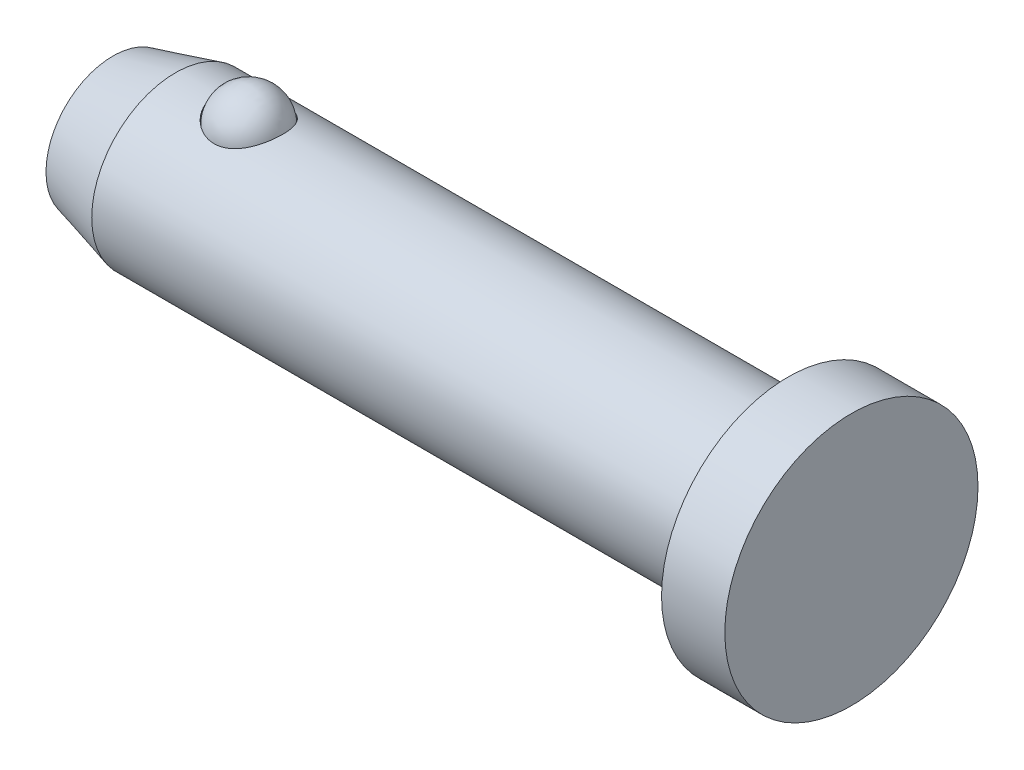
ISO-10303-21;
HEADER;
FILE_DESCRIPTION(('STEP AP214'),'2;1');
FILE_NAME('part.step','',(''),(''),'','','');
FILE_SCHEMA(('AUTOMOTIVE_DESIGN { 1 0 10303 214 1 1 1 1 }'));
ENDSEC;
DATA;
#1=APPLICATION_CONTEXT('core data for automotive mechanical design processes');
#2=APPLICATION_PROTOCOL_DEFINITION('international standard','automotive_design',2000,#1);
#3=PRODUCT_CONTEXT('',#1,'mechanical');
#4=PRODUCT('Part','Part','',(#3));
#5=PRODUCT_RELATED_PRODUCT_CATEGORY('part','',(#4));
#6=PRODUCT_DEFINITION_FORMATION('','',#4);
#7=PRODUCT_DEFINITION_CONTEXT('part definition',#1,'design');
#8=PRODUCT_DEFINITION('design','',#6,#7);
#9=PRODUCT_DEFINITION_SHAPE('','',#8);
#10=(LENGTH_UNIT() NAMED_UNIT(*) SI_UNIT(.MILLI.,.METRE.));
#11=(NAMED_UNIT(*) PLANE_ANGLE_UNIT() SI_UNIT($,.RADIAN.));
#12=(NAMED_UNIT(*) SI_UNIT($,.STERADIAN.) SOLID_ANGLE_UNIT());
#13=UNCERTAINTY_MEASURE_WITH_UNIT(LENGTH_MEASURE(1.E-05),#10,'distance_accuracy_value','');
#14=(GEOMETRIC_REPRESENTATION_CONTEXT(3) GLOBAL_UNCERTAINTY_ASSIGNED_CONTEXT((#13)) GLOBAL_UNIT_ASSIGNED_CONTEXT((#10,
#11,#12)) REPRESENTATION_CONTEXT('',''));
#15=CARTESIAN_POINT('',(0.,0.,0.));
#16=DIRECTION('',(0.,0.,1.));
#17=DIRECTION('',(1.,0.,0.));
#18=AXIS2_PLACEMENT_3D('',#15,#16,#17);
#19=CARTESIAN_POINT('',(-20.2908101482499,2.83464,0.));
#20=DIRECTION('',(-1.,0.,0.));
#21=DIRECTION('',(0.,1.,0.));
#22=AXIS2_PLACEMENT_3D('',#19,#20,#21);
#23=SPHERICAL_SURFACE('',#22,1.28015999999999);
#24=CARTESIAN_POINT('',(-21.5709701482499,2.83464,0.));
#25=VERTEX_POINT('',#24);
#26=VERTEX_LOOP('',#25);
#27=FACE_BOUND('',#26,.T.);
#28=ADVANCED_FACE('F36',(#27),#23,.T.);
#29=CLOSED_SHELL('',(#28));
#30=MANIFOLD_SOLID_BREP('B2',#29);
#31=CARTESIAN_POINT('',(2.38125,0.,0.));
#32=DIRECTION('',(-1.,0.,0.));
#33=DIRECTION('',(0.,0.,1.));
#34=AXIS2_PLACEMENT_3D('',#31,#32,#33);
#35=CYLINDRICAL_SURFACE('',#34,3.1496);
#36=CARTESIAN_POINT('',(0.,0.,0.));
#37=DIRECTION('',(-1.,0.,0.));
#38=DIRECTION('',(0.,0.,1.));
#39=AXIS2_PLACEMENT_3D('',#36,#37,#38);
#40=CIRCLE('',#39,3.1496);
#41=CARTESIAN_POINT('',(0.,0.,3.1496));
#42=VERTEX_POINT('',#41);
#43=EDGE_CURVE('E72',#42,#42,#40,.T.);
#44=ORIENTED_EDGE('',*,*,#43,.T.);
#45=EDGE_LOOP('',(#44));
#46=FACE_BOUND('',#45,.T.);
#47=CARTESIAN_POINT('',(-23.0491065552962,0.,0.));
#48=DIRECTION('',(-1.,0.,0.));
#49=DIRECTION('',(0.,0.,1.));
#50=AXIS2_PLACEMENT_3D('',#47,#48,#49);
#51=CIRCLE('',#50,3.1496);
#52=CARTESIAN_POINT('',(-23.0491065552962,0.,3.1496));
#53=VERTEX_POINT('',#52);
#54=EDGE_CURVE('E69',#53,#53,#51,.T.);
#55=ORIENTED_EDGE('',*,*,#54,.F.);
#56=EDGE_LOOP('',(#55));
#57=FACE_BOUND('',#56,.T.);
#58=CARTESIAN_POINT('',(-20.2908101482499,2.86644462365592,-1.30517254779463));
#59=CARTESIAN_POINT('',(-20.3584615700745,2.86645120810558,-1.30516627721907));
#60=CARTESIAN_POINT('',(-20.4262038763816,2.86889640922081,-1.2998296921368));
#61=CARTESIAN_POINT('',(-20.5597927545076,2.87841443133969,-1.27860756712863));
#62=CARTESIAN_POINT('',(-20.6256342907558,2.88549854300094,-1.26269628801136));
#63=CARTESIAN_POINT('',(-20.7532966399318,2.90345639685791,-1.22083373320291));
#64=CARTESIAN_POINT('',(-20.8151275870991,2.91432010753833,-1.19490901452217));
#65=CARTESIAN_POINT('',(-20.9333758926375,2.93865637911198,-1.13373584689953));
#66=CARTESIAN_POINT('',(-20.9897952223712,2.95212798455326,-1.09849081090784));
#67=CARTESIAN_POINT('',(-21.0976571877632,2.98074498577069,-1.0183323553499));
#68=CARTESIAN_POINT('',(-21.1488926959029,2.99592918687942,-0.973154297406758));
#69=CARTESIAN_POINT('',(-21.243273368842,3.02606872849191,-0.874942493647648));
#70=CARTESIAN_POINT('',(-21.2864161842841,3.04102400138281,-0.82190647459172));
#71=CARTESIAN_POINT('',(-21.3654635682132,3.06986483374138,-0.706806772891374));
#72=CARTESIAN_POINT('',(-21.4009696454553,3.0836751320368,-0.644449947334676));
#73=CARTESIAN_POINT('',(-21.4615279393875,3.10803791630581,-0.514260615012527));
#74=CARTESIAN_POINT('',(-21.4865797211067,3.11859026672152,-0.44642788055155));
#75=CARTESIAN_POINT('',(-21.5258432649537,3.13542350354035,-0.306720545547743));
#76=CARTESIAN_POINT('',(-21.5399867354117,3.14167745363759,-0.234823458328797));
#77=CARTESIAN_POINT('',(-21.5568768166277,3.14917053223427,-0.0894484319703957));
#78=CARTESIAN_POINT('',(-21.5596241666089,3.15040998600495,-0.0159705956789428));
#79=CARTESIAN_POINT('',(-21.5537013218313,3.14776543124335,0.129582760764466));
#80=CARTESIAN_POINT('',(-21.5451615760937,3.14393995900208,0.201664702371148));
#81=CARTESIAN_POINT('',(-21.5170675749165,3.13164785753818,0.343237304349766));
#82=CARTESIAN_POINT('',(-21.4975131818881,3.12318117034008,0.412727932340873));
#83=CARTESIAN_POINT('',(-21.4477405136155,3.1024305084263,0.547313676378039));
#84=CARTESIAN_POINT('',(-21.4175029903445,3.09013964841806,0.612400604299479));
#85=CARTESIAN_POINT('',(-21.3469744802468,3.06298509965563,0.736293755544046));
#86=CARTESIAN_POINT('',(-21.3066823856803,3.04812112746988,0.795099285808196));
#87=CARTESIAN_POINT('',(-21.2163549129872,3.01718244943965,0.905492865822567));
#88=CARTESIAN_POINT('',(-21.1662146218955,3.00109596437033,0.956991889068021));
#89=CARTESIAN_POINT('',(-21.0575932444339,2.9696347739982,1.05056759756218));
#90=CARTESIAN_POINT('',(-20.9991123664282,2.95426005092689,1.09264451812599));
#91=CARTESIAN_POINT('',(-20.8761067993376,2.92621382140221,1.16566188085754));
#92=CARTESIAN_POINT('',(-20.8116768479043,2.91350788022834,1.19674824847867));
#93=CARTESIAN_POINT('',(-20.677884917612,2.89208528207644,1.24763483683174));
#94=CARTESIAN_POINT('',(-20.6085248455949,2.88336709233661,1.26743939464355));
#95=CARTESIAN_POINT('',(-20.4705876605634,2.87134908188668,1.2944276664485));
#96=CARTESIAN_POINT('',(-20.402146622846,2.86779879634614,1.30219605165818));
#97=CARTESIAN_POINT('',(-20.2648319229011,2.86573303951103,1.30673731781528));
#98=CARTESIAN_POINT('',(-20.1959583626619,2.86721642271972,1.30351270040626));
#99=CARTESIAN_POINT('',(-20.0623493485509,2.87489141215312,1.28649091309454));
#100=CARTESIAN_POINT('',(-19.9975542222447,2.88091137048104,1.2730790489579));
#101=CARTESIAN_POINT('',(-19.8712707451091,2.89678755110716,1.23652566514967));
#102=CARTESIAN_POINT('',(-19.809782657288,2.9066440780153,1.2133833729049));
#103=CARTESIAN_POINT('',(-19.6904050490409,2.92938831614765,1.15740694245089));
#104=CARTESIAN_POINT('',(-19.6326163379987,2.94233453751268,1.12438213906298));
#105=CARTESIAN_POINT('',(-19.5233614374649,2.9698064487385,1.04967158608701));
#106=CARTESIAN_POINT('',(-19.4718967675169,2.98433251663115,1.00798376139446));
#107=CARTESIAN_POINT('',(-19.3738398555789,3.01431230742029,0.91456312218175));
#108=CARTESIAN_POINT('',(-19.3276403416089,3.02977497840605,0.862420579691551));
#109=CARTESIAN_POINT('',(-19.2443295333746,3.0593054267626,0.750967302894715));
#110=CARTESIAN_POINT('',(-19.2072198559509,3.07337295571019,0.691655296128649));
#111=CARTESIAN_POINT('',(-19.1418306904921,3.0991106045334,0.56547267360454));
#112=CARTESIAN_POINT('',(-19.1138546005728,3.11069464738316,0.498426853070583));
#113=CARTESIAN_POINT('',(-19.0689028037238,3.12971435338124,0.360186065118016));
#114=CARTESIAN_POINT('',(-19.0519268467929,3.13715011080756,0.288991192035472));
#115=CARTESIAN_POINT('',(-19.0293794429385,3.14709399458619,0.144825349487548));
#116=CARTESIAN_POINT('',(-19.0237546797191,3.1496251554703,0.071864319967431));
#117=CARTESIAN_POINT('',(-19.0238679510141,3.1495744672443,-0.0740445118091371));
#118=CARTESIAN_POINT('',(-19.0296054477903,3.14699286010458,-0.146992314528164));
#119=CARTESIAN_POINT('',(-19.0522211569186,3.1370217911424,-0.290135657969068));
#120=CARTESIAN_POINT('',(-19.0690009610771,3.12967480623413,-0.360349759795402));
#121=CARTESIAN_POINT('',(-19.1132647946634,3.11094224808444,-0.496749663785287));
#122=CARTESIAN_POINT('',(-19.1407495278568,3.09955640932429,-0.562935200771284));
#123=CARTESIAN_POINT('',(-19.2061398868693,3.07377872302876,-0.690003068394926));
#124=CARTESIAN_POINT('',(-19.2441281965399,3.05936325181532,-0.75083805084068));
#125=CARTESIAN_POINT('',(-19.3296530842171,3.02907533463561,-0.86497017477159));
#126=CARTESIAN_POINT('',(-19.3771897662726,3.01320287279351,-0.918267234105018));
#127=CARTESIAN_POINT('',(-19.4811162211087,2.9816078325526,-1.01620049828937));
#128=CARTESIAN_POINT('',(-19.5375585014219,2.96588677039235,-1.06078158191953));
#129=CARTESIAN_POINT('',(-19.6577729728809,2.93649460872109,-1.13963081158192));
#130=CARTESIAN_POINT('',(-19.7215478219846,2.92282425672961,-1.17389520156128));
#131=CARTESIAN_POINT('',(-19.8527336829711,2.89955852837399,-1.23022207572249));
#132=CARTESIAN_POINT('',(-19.9199875429827,2.88985734167204,-1.25260690052147));
#133=CARTESIAN_POINT('',(-20.0576462094761,2.87520526487589,-1.28589141852941));
#134=CARTESIAN_POINT('',(-20.128041533084,2.87024097315911,-1.29682352241848));
#135=CARTESIAN_POINT('',(-20.2294390756871,2.86694066963579,-1.30408092334315));
#136=CARTESIAN_POINT('',(-20.2601152570915,2.86644163615085,-1.30517539288833));
#137=CARTESIAN_POINT('',(-20.2908101482499,2.86644462365592,-1.30517254779463));
#138=B_SPLINE_CURVE_WITH_KNOTS('',3,(#58,#59,#60,#61,#62,#63,#64,#65,#66,#67,#68,#69,#70,#71,
#72,#73,#74,#75,#76,#77,#78,#79,#80,#81,#82,#83,#84,#85,#86,#87,#88,#89,#90,#91,#92,#93,#94,#95,
#96,#97,#98,#99,#100,#101,#102,#103,#104,#105,#106,#107,#108,#109,#110,#111,#112,#113,#114,#115,
#116,#117,#118,#119,#120,#121,#122,#123,#124,#125,#126,#127,#128,#129,#130,#131,#132,#133,#134,
#135,#136,#137),.UNSPECIFIED.,.T.,.F.,(4,2,2,2,2,2,2,2,2,2,2,2,2,2,2,2,2,2,2,2,2,2,2,2,2,2,2,2,
2,2,2,2,2,2,2,2,2,2,2,4),(0.,0.202862356260464,0.406220304192671,0.609042581825663,
0.811790691803013,1.02079120663656,1.22985230198783,1.44804538752031,1.66624755048738,
1.8858049259471,2.10534805932914,2.32237590954027,2.53940647080453,2.75683007173535,
2.97427763740671,3.19418134528355,3.41407956049735,3.63093755438937,3.8477121249412,
4.05358395260811,4.25940893378878,4.45781440961688,4.65623564135018,4.85876328856177,
5.0613395044486,5.27445367136232,5.48760571815017,5.70725037163231,5.92689003305073,
6.14549562821976,6.36409087775743,6.58076393611032,6.79745124143117,7.01589540596011,
7.2343419510099,7.45412821702284,7.6739944052875,7.88754250295521,8.10048462314081,
8.19252759544818),.UNSPECIFIED.);
#139=CARTESIAN_POINT('',(-20.2908101482499,2.86644462365592,-1.30517254779463));
#140=VERTEX_POINT('',#139);
#141=EDGE_CURVE('E52',#140,#140,#138,.T.);
#142=ORIENTED_EDGE('',*,*,#141,.F.);
#143=EDGE_LOOP('',(#142));
#144=FACE_BOUND('',#143,.T.);
#145=ADVANCED_FACE('F48',(#46,#57,#144),#35,.T.);
#146=CARTESIAN_POINT('',(0.,3.1496,0.));
#147=DIRECTION('',(1.,0.,0.));
#148=DIRECTION('',(0.,0.,-1.));
#149=AXIS2_PLACEMENT_3D('',#146,#147,#148);
#150=PLANE('',#149);
#151=ORIENTED_EDGE('',*,*,#43,.F.);
#152=EDGE_LOOP('',(#151));
#153=FACE_BOUND('',#152,.T.);
#154=CARTESIAN_POINT('',(0.,0.,0.));
#155=DIRECTION('',(-1.,0.,0.));
#156=DIRECTION('',(0.,0.,1.));
#157=AXIS2_PLACEMENT_3D('',#154,#155,#156);
#158=CIRCLE('',#157,4.7625);
#159=CARTESIAN_POINT('',(0.,0.,4.7625));
#160=VERTEX_POINT('',#159);
#161=EDGE_CURVE('E35',#160,#160,#158,.T.);
#162=ORIENTED_EDGE('',*,*,#161,.T.);
#163=EDGE_LOOP('',(#162));
#164=FACE_BOUND('',#163,.T.);
#165=ADVANCED_FACE('F50',(#153,#164),#150,.F.);
#166=CARTESIAN_POINT('',(2.38125,0.,0.));
#167=DIRECTION('',(-1.,0.,0.));
#168=DIRECTION('',(0.,0.,1.));
#169=AXIS2_PLACEMENT_3D('',#166,#167,#168);
#170=CYLINDRICAL_SURFACE('',#169,4.7625);
#171=ORIENTED_EDGE('',*,*,#161,.F.);
#172=EDGE_LOOP('',(#171));
#173=FACE_BOUND('',#172,.T.);
#174=CARTESIAN_POINT('',(2.38125,0.,0.));
#175=DIRECTION('',(-1.,0.,0.));
#176=DIRECTION('',(0.,0.,1.));
#177=AXIS2_PLACEMENT_3D('',#174,#175,#176);
#178=CIRCLE('',#177,4.7625);
#179=CARTESIAN_POINT('',(2.38125,0.,4.7625));
#180=VERTEX_POINT('',#179);
#181=EDGE_CURVE('E60',#180,#180,#178,.T.);
#182=ORIENTED_EDGE('',*,*,#181,.T.);
#183=EDGE_LOOP('',(#182));
#184=FACE_BOUND('',#183,.T.);
#185=ADVANCED_FACE('F85',(#173,#184),#170,.T.);
#186=CARTESIAN_POINT('',(2.38125,4.7625,0.));
#187=DIRECTION('',(-1.,0.,0.));
#188=DIRECTION('',(0.,0.,1.));
#189=AXIS2_PLACEMENT_3D('',#186,#187,#188);
#190=PLANE('',#189);
#191=ORIENTED_EDGE('',*,*,#181,.F.);
#192=EDGE_LOOP('',(#191));
#193=FACE_BOUND('',#192,.T.);
#194=ADVANCED_FACE('F98',(#193),#190,.F.);
#195=CARTESIAN_POINT('',(-25.4,2.51968,0.));
#196=DIRECTION('',(1.,0.,0.));
#197=DIRECTION('',(0.,0.,-1.));
#198=AXIS2_PLACEMENT_3D('',#195,#196,#197);
#199=PLANE('',#198);
#200=CARTESIAN_POINT('',(-25.4,0.,0.));
#201=DIRECTION('',(-1.,0.,0.));
#202=DIRECTION('',(0.,0.,1.));
#203=AXIS2_PLACEMENT_3D('',#200,#201,#202);
#204=CIRCLE('',#203,2.51968);
#205=CARTESIAN_POINT('',(-25.4,0.,2.51968));
#206=VERTEX_POINT('',#205);
#207=EDGE_CURVE('E64',#206,#206,#204,.T.);
#208=ORIENTED_EDGE('',*,*,#207,.T.);
#209=EDGE_LOOP('',(#208));
#210=FACE_BOUND('',#209,.T.);
#211=ADVANCED_FACE('F94',(#210),#199,.F.);
#212=CARTESIAN_POINT('',(-23.0491065552962,0.,0.));
#213=DIRECTION('',(1.,0.,0.));
#214=DIRECTION('',(0.,0.,-1.));
#215=AXIS2_PLACEMENT_3D('',#212,#213,#214);
#216=CONICAL_SURFACE('',#215,3.1496,0.261799387799151);
#217=ORIENTED_EDGE('',*,*,#207,.F.);
#218=EDGE_LOOP('',(#217));
#219=FACE_BOUND('',#218,.T.);
#220=ORIENTED_EDGE('',*,*,#54,.T.);
#221=EDGE_LOOP('',(#220));
#222=FACE_BOUND('',#221,.T.);
#223=ADVANCED_FACE('F91',(#219,#222),#216,.T.);
#224=CARTESIAN_POINT('',(-20.2908101482499,2.83464,0.));
#225=DIRECTION('',(-1.,0.,0.));
#226=DIRECTION('',(0.,1.,0.));
#227=AXIS2_PLACEMENT_3D('',#224,#225,#226);
#228=SPHERICAL_SURFACE('',#227,1.30555999999999);
#229=ORIENTED_EDGE('',*,*,#141,.T.);
#230=EDGE_LOOP('',(#229));
#231=FACE_BOUND('',#230,.T.);
#232=ADVANCED_FACE('F79',(#231),#228,.F.);
#233=CLOSED_SHELL('',(#145,#165,#185,#194,#211,#223,#232));
#234=MANIFOLD_SOLID_BREP('B6',#233);
#235=ADVANCED_BREP_SHAPE_REPRESENTATION('',(#18,#30,#234),#14);
#236=SHAPE_DEFINITION_REPRESENTATION(#9,#235);
ENDSEC;
END-ISO-10303-21;
